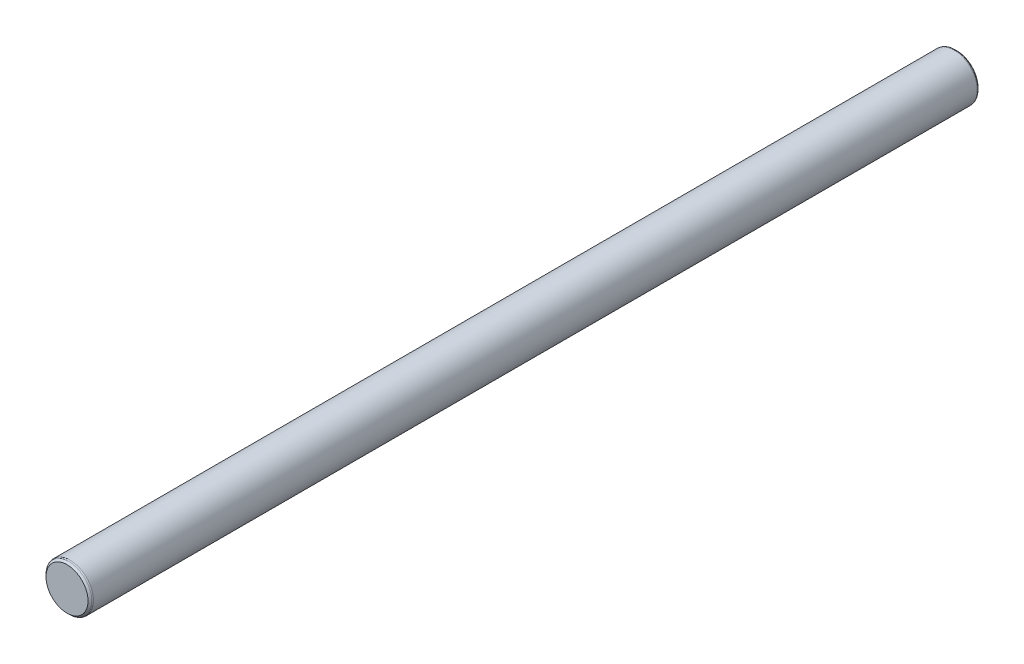
ISO-10303-21;
HEADER;
FILE_DESCRIPTION(('STEP AP214'),'2;1');
FILE_NAME('part.step','',(''),(''),'','','');
FILE_SCHEMA(('AUTOMOTIVE_DESIGN { 1 0 10303 214 1 1 1 1 }'));
ENDSEC;
DATA;
#1=APPLICATION_CONTEXT('core data for automotive mechanical design processes');
#2=APPLICATION_PROTOCOL_DEFINITION('international standard','automotive_design',2000,#1);
#3=PRODUCT_CONTEXT('',#1,'mechanical');
#4=PRODUCT('Part','Part','',(#3));
#5=PRODUCT_RELATED_PRODUCT_CATEGORY('part','',(#4));
#6=PRODUCT_DEFINITION_FORMATION('','',#4);
#7=PRODUCT_DEFINITION_CONTEXT('part definition',#1,'design');
#8=PRODUCT_DEFINITION('design','',#6,#7);
#9=PRODUCT_DEFINITION_SHAPE('','',#8);
#10=(LENGTH_UNIT() NAMED_UNIT(*) SI_UNIT(.MILLI.,.METRE.));
#11=(NAMED_UNIT(*) PLANE_ANGLE_UNIT() SI_UNIT($,.RADIAN.));
#12=(NAMED_UNIT(*) SI_UNIT($,.STERADIAN.) SOLID_ANGLE_UNIT());
#13=UNCERTAINTY_MEASURE_WITH_UNIT(LENGTH_MEASURE(1.E-05),#10,'distance_accuracy_value','');
#14=(GEOMETRIC_REPRESENTATION_CONTEXT(3) GLOBAL_UNCERTAINTY_ASSIGNED_CONTEXT((#13)) GLOBAL_UNIT_ASSIGNED_CONTEXT((#10,
#11,#12)) REPRESENTATION_CONTEXT('',''));
#15=CARTESIAN_POINT('',(0.,0.,0.));
#16=DIRECTION('',(0.,0.,1.));
#17=DIRECTION('',(1.,0.,0.));
#18=AXIS2_PLACEMENT_3D('',#15,#16,#17);
#19=CARTESIAN_POINT('',(0.,0.,57.15));
#20=DIRECTION('',(0.,0.,-1.));
#21=DIRECTION('',(-1.,0.,0.));
#22=AXIS2_PLACEMENT_3D('',#19,#20,#21);
#23=CYLINDRICAL_SURFACE('',#22,3.);
#24=CARTESIAN_POINT('',(0.,0.,56.756801948466));
#25=DIRECTION('',(0.,0.,1.));
#26=DIRECTION('',(1.,0.,0.));
#27=AXIS2_PLACEMENT_3D('',#24,#25,#26);
#28=CIRCLE('',#27,3.);
#29=CARTESIAN_POINT('',(3.,0.,56.756801948466));
#30=VERTEX_POINT('',#29);
#31=EDGE_CURVE('E56',#30,#30,#28,.F.);
#32=ORIENTED_EDGE('',*,*,#31,.T.);
#33=EDGE_LOOP('',(#32));
#34=FACE_BOUND('',#33,.T.);
#35=CARTESIAN_POINT('',(0.,0.,-56.756801948466));
#36=DIRECTION('',(0.,0.,-1.));
#37=DIRECTION('',(-1.,0.,0.));
#38=AXIS2_PLACEMENT_3D('',#35,#36,#37);
#39=CIRCLE('',#38,3.);
#40=CARTESIAN_POINT('',(-3.,0.,-56.756801948466));
#41=VERTEX_POINT('',#40);
#42=EDGE_CURVE('E61',#41,#41,#39,.F.);
#43=ORIENTED_EDGE('',*,*,#42,.T.);
#44=EDGE_LOOP('',(#43));
#45=FACE_BOUND('',#44,.T.);
#46=ADVANCED_FACE('F43',(#34,#45),#23,.T.);
#47=CARTESIAN_POINT('',(0.,0.,57.15));
#48=DIRECTION('',(0.,0.,1.));
#49=DIRECTION('',(1.,0.,0.));
#50=AXIS2_PLACEMENT_3D('',#47,#48,#49);
#51=PLANE('',#50);
#52=CARTESIAN_POINT('',(0.,0.,57.15));
#53=DIRECTION('',(0.,0.,1.));
#54=DIRECTION('',(1.,0.,0.));
#55=AXIS2_PLACEMENT_3D('',#52,#53,#54);
#56=CIRCLE('',#55,2.69999999999998);
#57=CARTESIAN_POINT('',(2.69999999999998,0.,57.15));
#58=VERTEX_POINT('',#57);
#59=EDGE_CURVE('E71',#58,#58,#56,.T.);
#60=ORIENTED_EDGE('',*,*,#59,.T.);
#61=EDGE_LOOP('',(#60));
#62=FACE_BOUND('',#61,.T.);
#63=ADVANCED_FACE('F76',(#62),#51,.T.);
#64=CARTESIAN_POINT('',(0.,0.,-57.15));
#65=DIRECTION('',(0.,0.,1.));
#66=DIRECTION('',(1.,0.,0.));
#67=AXIS2_PLACEMENT_3D('',#64,#65,#66);
#68=PLANE('',#67);
#69=CARTESIAN_POINT('',(0.,0.,-57.15));
#70=DIRECTION('',(0.,0.,1.));
#71=DIRECTION('',(1.,0.,0.));
#72=AXIS2_PLACEMENT_3D('',#69,#70,#71);
#73=CIRCLE('',#72,2.69999999999995);
#74=CARTESIAN_POINT('',(2.69999999999995,0.,-57.15));
#75=VERTEX_POINT('',#74);
#76=EDGE_CURVE('E67',#75,#75,#73,.F.);
#77=ORIENTED_EDGE('',*,*,#76,.T.);
#78=EDGE_LOOP('',(#77));
#79=FACE_BOUND('',#78,.T.);
#80=ADVANCED_FACE('F81',(#79),#68,.F.);
#81=CARTESIAN_POINT('',(0.,0.,57.15));
#82=DIRECTION('',(0.,0.,-1.));
#83=DIRECTION('',(-1.,0.,0.));
#84=AXIS2_PLACEMENT_3D('',#81,#82,#83);
#85=CONICAL_SURFACE('',#84,2.69999999999998,0.785398163397458);
#86=CARTESIAN_POINT('',(0.,0.,56.915900974233));
#87=DIRECTION('',(0.,0.,-1.));
#88=DIRECTION('',(-1.,0.,0.));
#89=AXIS2_PLACEMENT_3D('',#86,#87,#88);
#90=CIRCLE('',#89,2.93409902576697);
#91=CARTESIAN_POINT('',(-2.93409902576697,0.,56.915900974233));
#92=VERTEX_POINT('',#91);
#93=EDGE_CURVE('E51',#92,#92,#90,.F.);
#94=ORIENTED_EDGE('',*,*,#93,.T.);
#95=EDGE_LOOP('',(#94));
#96=FACE_BOUND('',#95,.T.);
#97=ORIENTED_EDGE('',*,*,#59,.F.);
#98=EDGE_LOOP('',(#97));
#99=FACE_BOUND('',#98,.T.);
#100=ADVANCED_FACE('F78',(#96,#99),#85,.T.);
#101=CARTESIAN_POINT('',(0.,0.,-56.8499999999999));
#102=DIRECTION('',(0.,0.,1.));
#103=DIRECTION('',(1.,0.,0.));
#104=AXIS2_PLACEMENT_3D('',#101,#102,#103);
#105=CONICAL_SURFACE('',#104,3.,0.785398163397423);
#106=CARTESIAN_POINT('',(0.,0.,-56.915900974233));
#107=DIRECTION('',(0.,0.,1.));
#108=DIRECTION('',(1.,0.,0.));
#109=AXIS2_PLACEMENT_3D('',#106,#107,#108);
#110=CIRCLE('',#109,2.93409902576698);
#111=CARTESIAN_POINT('',(2.93409902576698,0.,-56.915900974233));
#112=VERTEX_POINT('',#111);
#113=EDGE_CURVE('E10',#112,#112,#110,.F.);
#114=ORIENTED_EDGE('',*,*,#113,.T.);
#115=EDGE_LOOP('',(#114));
#116=FACE_BOUND('',#115,.T.);
#117=ORIENTED_EDGE('',*,*,#76,.F.);
#118=EDGE_LOOP('',(#117));
#119=FACE_BOUND('',#118,.T.);
#120=ADVANCED_FACE('F80',(#116,#119),#105,.T.);
#121=CARTESIAN_POINT('',(0.,0.,56.756801948466));
#122=DIRECTION('',(0.,0.,1.));
#123=DIRECTION('',(1.,0.,0.));
#124=AXIS2_PLACEMENT_3D('',#121,#122,#123);
#125=TOROIDAL_SURFACE('',#124,2.775,0.225);
#126=ORIENTED_EDGE('',*,*,#93,.F.);
#127=EDGE_LOOP('',(#126));
#128=FACE_BOUND('',#127,.T.);
#129=ORIENTED_EDGE('',*,*,#31,.F.);
#130=EDGE_LOOP('',(#129));
#131=FACE_BOUND('',#130,.T.);
#132=ADVANCED_FACE('F87',(#128,#131),#125,.T.);
#133=CARTESIAN_POINT('',(0.,0.,-56.756801948466));
#134=DIRECTION('',(0.,0.,-1.));
#135=DIRECTION('',(-1.,0.,0.));
#136=AXIS2_PLACEMENT_3D('',#133,#134,#135);
#137=TOROIDAL_SURFACE('',#136,2.775,0.225);
#138=ORIENTED_EDGE('',*,*,#113,.F.);
#139=EDGE_LOOP('',(#138));
#140=FACE_BOUND('',#139,.T.);
#141=ORIENTED_EDGE('',*,*,#42,.F.);
#142=EDGE_LOOP('',(#141));
#143=FACE_BOUND('',#142,.T.);
#144=ADVANCED_FACE('F45',(#140,#143),#137,.T.);
#145=CLOSED_SHELL('',(#46,#63,#80,#100,#120,#132,#144));
#146=MANIFOLD_SOLID_BREP('B2',#145);
#147=ADVANCED_BREP_SHAPE_REPRESENTATION('',(#18,#146),#14);
#148=SHAPE_DEFINITION_REPRESENTATION(#9,#147);
ENDSEC;
END-ISO-10303-21;
